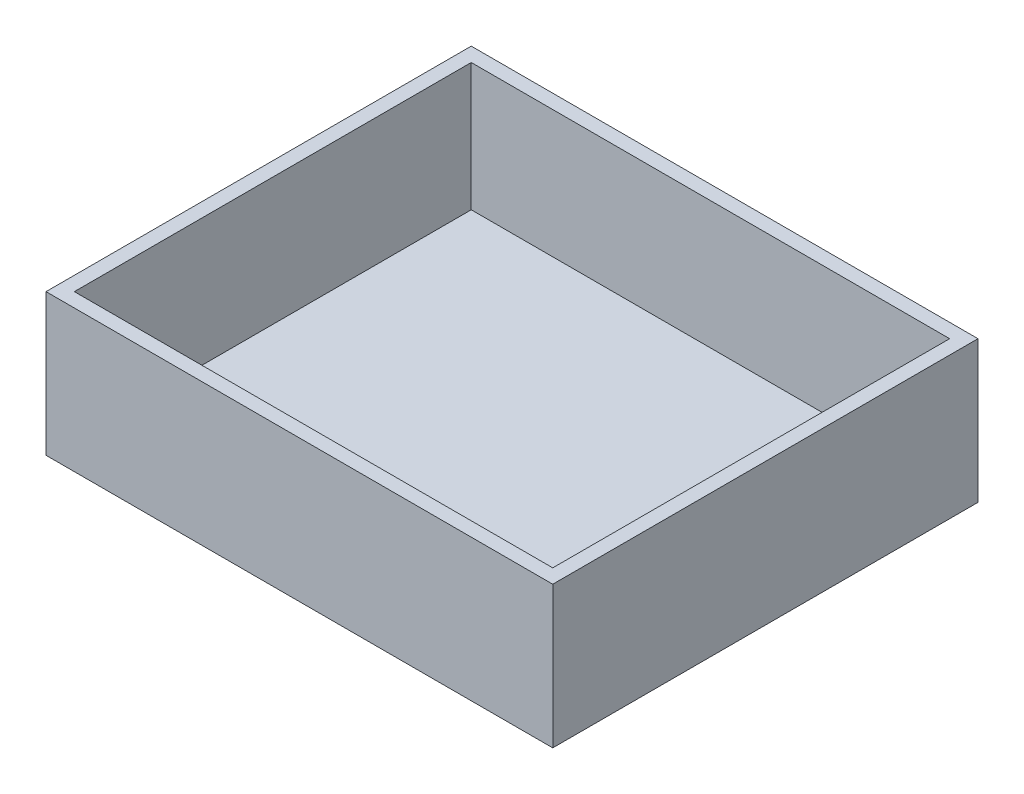
ISO-10303-21;
HEADER;
FILE_DESCRIPTION(('STEP AP214'),'2;1');
FILE_NAME('part.step','',(''),(''),'','','');
FILE_SCHEMA(('AUTOMOTIVE_DESIGN { 1 0 10303 214 1 1 1 1 }'));
ENDSEC;
DATA;
#1=APPLICATION_CONTEXT('core data for automotive mechanical design processes');
#2=APPLICATION_PROTOCOL_DEFINITION('international standard','automotive_design',2000,#1);
#3=PRODUCT_CONTEXT('',#1,'mechanical');
#4=PRODUCT('Part','Part','',(#3));
#5=PRODUCT_RELATED_PRODUCT_CATEGORY('part','',(#4));
#6=PRODUCT_DEFINITION_FORMATION('','',#4);
#7=PRODUCT_DEFINITION_CONTEXT('part definition',#1,'design');
#8=PRODUCT_DEFINITION('design','',#6,#7);
#9=PRODUCT_DEFINITION_SHAPE('','',#8);
#10=(LENGTH_UNIT() NAMED_UNIT(*) SI_UNIT(.MILLI.,.METRE.));
#11=(NAMED_UNIT(*) PLANE_ANGLE_UNIT() SI_UNIT($,.RADIAN.));
#12=(NAMED_UNIT(*) SI_UNIT($,.STERADIAN.) SOLID_ANGLE_UNIT());
#13=UNCERTAINTY_MEASURE_WITH_UNIT(LENGTH_MEASURE(1.E-05),#10,'distance_accuracy_value','');
#14=(GEOMETRIC_REPRESENTATION_CONTEXT(3) GLOBAL_UNCERTAINTY_ASSIGNED_CONTEXT((#13)) GLOBAL_UNIT_ASSIGNED_CONTEXT((#10,
#11,#12)) REPRESENTATION_CONTEXT('',''));
#15=CARTESIAN_POINT('',(0.,0.,0.));
#16=DIRECTION('',(0.,0.,1.));
#17=DIRECTION('',(1.,0.,0.));
#18=AXIS2_PLACEMENT_3D('',#15,#16,#17);
#19=CARTESIAN_POINT('',(0.,0.,0.));
#20=DIRECTION('',(0.,1.,0.));
#21=DIRECTION('',(0.,0.,1.));
#22=AXIS2_PLACEMENT_3D('',#19,#20,#21);
#23=PLANE('',#22);
#24=DIRECTION('',(0.,0.,-1.));
#25=VECTOR('',#24,1.);
#26=CARTESIAN_POINT('',(-29.25,0.,-19.0576678956372));
#27=LINE('',#26,#25);
#28=CARTESIAN_POINT('',(-29.25,0.,-19.0576678956372));
#29=VERTEX_POINT('',#28);
#30=CARTESIAN_POINT('',(-29.25,0.,-24.));
#31=VERTEX_POINT('',#30);
#32=EDGE_CURVE('E224',#29,#31,#27,.T.);
#33=ORIENTED_EDGE('',*,*,#32,.F.);
#34=DIRECTION('',(-1.,0.,0.));
#35=VECTOR('',#34,1.);
#36=CARTESIAN_POINT('',(-29.25,0.,-19.0576678956372));
#37=LINE('',#36,#35);
#38=CARTESIAN_POINT('',(-0.13705379520795,0.,-19.0576678956372));
#39=VERTEX_POINT('',#38);
#40=EDGE_CURVE('E209',#39,#29,#37,.T.);
#41=ORIENTED_EDGE('',*,*,#40,.F.);
#42=DIRECTION('',(0.,0.,1.));
#43=VECTOR('',#42,1.);
#44=CARTESIAN_POINT('',(-0.13705379520795,0.,-19.0576678956372));
#45=LINE('',#44,#43);
#46=CARTESIAN_POINT('',(-0.137053795207948,0.,-24.));
#47=VERTEX_POINT('',#46);
#48=EDGE_CURVE('E212',#47,#39,#45,.T.);
#49=ORIENTED_EDGE('',*,*,#48,.F.);
#50=DIRECTION('',(1.,0.,0.));
#51=VECTOR('',#50,1.);
#52=CARTESIAN_POINT('',(-29.25,0.,-24.));
#53=LINE('',#52,#51);
#54=EDGE_CURVE('E218',#31,#47,#53,.T.);
#55=ORIENTED_EDGE('',*,*,#54,.F.);
#56=EDGE_LOOP('',(#33,#41,#49,#55));
#57=FACE_BOUND('',#56,.T.);
#58=DIRECTION('',(0.,0.,1.));
#59=VECTOR('',#58,1.);
#60=CARTESIAN_POINT('',(-35.75,0.,30.));
#61=LINE('',#60,#59);
#62=CARTESIAN_POINT('',(-35.75,0.,-30.));
#63=VERTEX_POINT('',#62);
#64=CARTESIAN_POINT('',(-35.75,0.,30.));
#65=VERTEX_POINT('',#64);
#66=EDGE_CURVE('E244',#63,#65,#61,.T.);
#67=ORIENTED_EDGE('',*,*,#66,.F.);
#68=DIRECTION('',(-1.,0.,0.));
#69=VECTOR('',#68,1.);
#70=CARTESIAN_POINT('',(35.75,0.,-30.));
#71=LINE('',#70,#69);
#72=CARTESIAN_POINT('',(35.75,0.,-30.));
#73=VERTEX_POINT('',#72);
#74=EDGE_CURVE('E283',#73,#63,#71,.T.);
#75=ORIENTED_EDGE('',*,*,#74,.F.);
#76=DIRECTION('',(0.,0.,-1.));
#77=VECTOR('',#76,1.);
#78=CARTESIAN_POINT('',(35.75,0.,30.));
#79=LINE('',#78,#77);
#80=CARTESIAN_POINT('',(35.75,0.,30.));
#81=VERTEX_POINT('',#80);
#82=EDGE_CURVE('E299',#81,#73,#79,.T.);
#83=ORIENTED_EDGE('',*,*,#82,.F.);
#84=DIRECTION('',(1.,0.,0.));
#85=VECTOR('',#84,1.);
#86=CARTESIAN_POINT('',(35.75,0.,30.));
#87=LINE('',#86,#85);
#88=EDGE_CURVE('E294',#65,#81,#87,.T.);
#89=ORIENTED_EDGE('',*,*,#88,.F.);
#90=EDGE_LOOP('',(#67,#75,#83,#89));
#91=FACE_BOUND('',#90,.T.);
#92=DIRECTION('',(0.,0.,-1.));
#93=VECTOR('',#92,1.);
#94=CARTESIAN_POINT('',(-29.25,0.,24.));
#95=LINE('',#94,#93);
#96=CARTESIAN_POINT('',(-29.25,0.,24.));
#97=VERTEX_POINT('',#96);
#98=CARTESIAN_POINT('',(-29.25,0.,19.5975167891978));
#99=VERTEX_POINT('',#98);
#100=EDGE_CURVE('E63',#97,#99,#95,.T.);
#101=ORIENTED_EDGE('',*,*,#100,.F.);
#102=DIRECTION('',(-1.,0.,0.));
#103=VECTOR('',#102,1.);
#104=CARTESIAN_POINT('',(-29.25,0.,24.));
#105=LINE('',#104,#103);
#106=CARTESIAN_POINT('',(3.45030543518834,0.,24.));
#107=VERTEX_POINT('',#106);
#108=EDGE_CURVE('E61',#107,#97,#105,.T.);
#109=ORIENTED_EDGE('',*,*,#108,.F.);
#110=DIRECTION('',(0.,0.,1.));
#111=VECTOR('',#110,1.);
#112=CARTESIAN_POINT('',(3.45030543518834,0.,24.));
#113=LINE('',#112,#111);
#114=CARTESIAN_POINT('',(3.45030543518834,0.,19.5975167891978));
#115=VERTEX_POINT('',#114);
#116=EDGE_CURVE('E543',#115,#107,#113,.T.);
#117=ORIENTED_EDGE('',*,*,#116,.F.);
#118=DIRECTION('',(1.,0.,0.));
#119=VECTOR('',#118,1.);
#120=CARTESIAN_POINT('',(-29.25,0.,19.5975167891978));
#121=LINE('',#120,#119);
#122=EDGE_CURVE('E554',#99,#115,#121,.T.);
#123=ORIENTED_EDGE('',*,*,#122,.F.);
#124=EDGE_LOOP('',(#101,#109,#117,#123));
#125=FACE_BOUND('',#124,.T.);
#126=ADVANCED_FACE('F44',(#57,#91,#125),#23,.F.);
#127=CARTESIAN_POINT('',(-35.75,20.,30.));
#128=DIRECTION('',(1.,0.,0.));
#129=DIRECTION('',(0.,0.,-1.));
#130=AXIS2_PLACEMENT_3D('',#127,#128,#129);
#131=PLANE('',#130);
#132=ORIENTED_EDGE('',*,*,#66,.T.);
#133=DIRECTION('',(0.,-1.,0.));
#134=VECTOR('',#133,1.);
#135=CARTESIAN_POINT('',(-35.75,20.,30.));
#136=LINE('',#135,#134);
#137=CARTESIAN_POINT('',(-35.75,20.,30.));
#138=VERTEX_POINT('',#137);
#139=EDGE_CURVE('E11',#138,#65,#136,.T.);
#140=ORIENTED_EDGE('',*,*,#139,.F.);
#141=DIRECTION('',(0.,0.,1.));
#142=VECTOR('',#141,1.);
#143=CARTESIAN_POINT('',(-35.75,20.,30.));
#144=LINE('',#143,#142);
#145=CARTESIAN_POINT('',(-35.75,20.,-30.));
#146=VERTEX_POINT('',#145);
#147=EDGE_CURVE('E277',#146,#138,#144,.T.);
#148=ORIENTED_EDGE('',*,*,#147,.F.);
#149=DIRECTION('',(0.,-1.,0.));
#150=VECTOR('',#149,1.);
#151=CARTESIAN_POINT('',(-35.75,20.,-30.));
#152=LINE('',#151,#150);
#153=EDGE_CURVE('E289',#146,#63,#152,.T.);
#154=ORIENTED_EDGE('',*,*,#153,.T.);
#155=EDGE_LOOP('',(#132,#140,#148,#154));
#156=FACE_BOUND('',#155,.T.);
#157=ADVANCED_FACE('F50',(#156),#131,.F.);
#158=CARTESIAN_POINT('',(35.75,20.,30.));
#159=DIRECTION('',(0.,0.,-1.));
#160=DIRECTION('',(-1.,0.,0.));
#161=AXIS2_PLACEMENT_3D('',#158,#159,#160);
#162=PLANE('',#161);
#163=ORIENTED_EDGE('',*,*,#88,.T.);
#164=DIRECTION('',(0.,-1.,0.));
#165=VECTOR('',#164,1.);
#166=CARTESIAN_POINT('',(35.75,20.,30.));
#167=LINE('',#166,#165);
#168=CARTESIAN_POINT('',(35.75,20.,30.));
#169=VERTEX_POINT('',#168);
#170=EDGE_CURVE('E53',#169,#81,#167,.T.);
#171=ORIENTED_EDGE('',*,*,#170,.F.);
#172=DIRECTION('',(1.,0.,0.));
#173=VECTOR('',#172,1.);
#174=CARTESIAN_POINT('',(35.75,20.,30.));
#175=LINE('',#174,#173);
#176=EDGE_CURVE('E278',#138,#169,#175,.T.);
#177=ORIENTED_EDGE('',*,*,#176,.F.);
#178=ORIENTED_EDGE('',*,*,#139,.T.);
#179=EDGE_LOOP('',(#163,#171,#177,#178));
#180=FACE_BOUND('',#179,.T.);
#181=ADVANCED_FACE('F328',(#180),#162,.F.);
#182=CARTESIAN_POINT('',(35.75,20.,30.));
#183=DIRECTION('',(-1.,0.,0.));
#184=DIRECTION('',(0.,0.,1.));
#185=AXIS2_PLACEMENT_3D('',#182,#183,#184);
#186=PLANE('',#185);
#187=ORIENTED_EDGE('',*,*,#82,.T.);
#188=DIRECTION('',(0.,-1.,0.));
#189=VECTOR('',#188,1.);
#190=CARTESIAN_POINT('',(35.75,20.,-30.));
#191=LINE('',#190,#189);
#192=CARTESIAN_POINT('',(35.75,20.,-30.));
#193=VERTEX_POINT('',#192);
#194=EDGE_CURVE('E304',#193,#73,#191,.T.);
#195=ORIENTED_EDGE('',*,*,#194,.F.);
#196=DIRECTION('',(0.,0.,-1.));
#197=VECTOR('',#196,1.);
#198=CARTESIAN_POINT('',(35.75,20.,30.));
#199=LINE('',#198,#197);
#200=EDGE_CURVE('E285',#169,#193,#199,.T.);
#201=ORIENTED_EDGE('',*,*,#200,.F.);
#202=ORIENTED_EDGE('',*,*,#170,.T.);
#203=EDGE_LOOP('',(#187,#195,#201,#202));
#204=FACE_BOUND('',#203,.T.);
#205=ADVANCED_FACE('F314',(#204),#186,.F.);
#206=CARTESIAN_POINT('',(35.75,20.,-30.));
#207=DIRECTION('',(0.,0.,1.));
#208=DIRECTION('',(1.,0.,0.));
#209=AXIS2_PLACEMENT_3D('',#206,#207,#208);
#210=PLANE('',#209);
#211=ORIENTED_EDGE('',*,*,#74,.T.);
#212=ORIENTED_EDGE('',*,*,#153,.F.);
#213=DIRECTION('',(-1.,0.,0.));
#214=VECTOR('',#213,1.);
#215=CARTESIAN_POINT('',(35.75,20.,-30.));
#216=LINE('',#215,#214);
#217=EDGE_CURVE('E290',#193,#146,#216,.T.);
#218=ORIENTED_EDGE('',*,*,#217,.F.);
#219=ORIENTED_EDGE('',*,*,#194,.T.);
#220=EDGE_LOOP('',(#211,#212,#218,#219));
#221=FACE_BOUND('',#220,.T.);
#222=ADVANCED_FACE('F325',(#221),#210,.F.);
#223=CARTESIAN_POINT('',(0.,20.,0.));
#224=DIRECTION('',(0.,1.,0.));
#225=DIRECTION('',(0.,0.,1.));
#226=AXIS2_PLACEMENT_3D('',#223,#224,#225);
#227=PLANE('',#226);
#228=DIRECTION('',(0.,0.,1.));
#229=VECTOR('',#228,1.);
#230=CARTESIAN_POINT('',(-33.75,20.,30.));
#231=LINE('',#230,#229);
#232=CARTESIAN_POINT('',(-33.75,20.,-28.));
#233=VERTEX_POINT('',#232);
#234=CARTESIAN_POINT('',(-33.75,20.,28.));
#235=VERTEX_POINT('',#234);
#236=EDGE_CURVE('E262',#233,#235,#231,.T.);
#237=ORIENTED_EDGE('',*,*,#236,.F.);
#238=DIRECTION('',(-1.,0.,0.));
#239=VECTOR('',#238,1.);
#240=CARTESIAN_POINT('',(35.75,20.,-28.));
#241=LINE('',#240,#239);
#242=CARTESIAN_POINT('',(33.75,20.,-28.));
#243=VERTEX_POINT('',#242);
#244=EDGE_CURVE('E248',#243,#233,#241,.T.);
#245=ORIENTED_EDGE('',*,*,#244,.F.);
#246=DIRECTION('',(0.,0.,-1.));
#247=VECTOR('',#246,1.);
#248=CARTESIAN_POINT('',(33.75,20.,30.));
#249=LINE('',#248,#247);
#250=CARTESIAN_POINT('',(33.75,20.,28.));
#251=VERTEX_POINT('',#250);
#252=EDGE_CURVE('E269',#251,#243,#249,.T.);
#253=ORIENTED_EDGE('',*,*,#252,.F.);
#254=DIRECTION('',(1.,0.,0.));
#255=VECTOR('',#254,1.);
#256=CARTESIAN_POINT('',(35.75,20.,28.));
#257=LINE('',#256,#255);
#258=EDGE_CURVE('E270',#235,#251,#257,.T.);
#259=ORIENTED_EDGE('',*,*,#258,.F.);
#260=EDGE_LOOP('',(#237,#245,#253,#259));
#261=FACE_BOUND('',#260,.T.);
#262=ORIENTED_EDGE('',*,*,#147,.T.);
#263=ORIENTED_EDGE('',*,*,#176,.T.);
#264=ORIENTED_EDGE('',*,*,#200,.T.);
#265=ORIENTED_EDGE('',*,*,#217,.T.);
#266=EDGE_LOOP('',(#262,#263,#264,#265));
#267=FACE_BOUND('',#266,.T.);
#268=ADVANCED_FACE('F327',(#261,#267),#227,.T.);
#269=CARTESIAN_POINT('',(-33.75,20.,30.));
#270=DIRECTION('',(1.,0.,0.));
#271=DIRECTION('',(0.,0.,-1.));
#272=AXIS2_PLACEMENT_3D('',#269,#270,#271);
#273=PLANE('',#272);
#274=DIRECTION('',(0.,0.,1.));
#275=VECTOR('',#274,1.);
#276=CARTESIAN_POINT('',(-33.75,2.,30.));
#277=LINE('',#276,#275);
#278=CARTESIAN_POINT('',(-33.75,2.,-28.));
#279=VERTEX_POINT('',#278);
#280=CARTESIAN_POINT('',(-33.75,2.,28.));
#281=VERTEX_POINT('',#280);
#282=EDGE_CURVE('E185',#279,#281,#277,.T.);
#283=ORIENTED_EDGE('',*,*,#282,.F.);
#284=DIRECTION('',(0.,-1.,0.));
#285=VECTOR('',#284,1.);
#286=CARTESIAN_POINT('',(-33.75,20.,-28.));
#287=LINE('',#286,#285);
#288=EDGE_CURVE('E245',#233,#279,#287,.T.);
#289=ORIENTED_EDGE('',*,*,#288,.F.);
#290=ORIENTED_EDGE('',*,*,#236,.T.);
#291=DIRECTION('',(0.,-1.,0.));
#292=VECTOR('',#291,1.);
#293=CARTESIAN_POINT('',(-33.75,20.,28.));
#294=LINE('',#293,#292);
#295=EDGE_CURVE('E236',#235,#281,#294,.T.);
#296=ORIENTED_EDGE('',*,*,#295,.T.);
#297=EDGE_LOOP('',(#283,#289,#290,#296));
#298=FACE_BOUND('',#297,.T.);
#299=ADVANCED_FACE('F348',(#298),#273,.T.);
#300=CARTESIAN_POINT('',(35.75,20.,28.));
#301=DIRECTION('',(0.,0.,-1.));
#302=DIRECTION('',(-1.,0.,0.));
#303=AXIS2_PLACEMENT_3D('',#300,#301,#302);
#304=PLANE('',#303);
#305=DIRECTION('',(1.,0.,0.));
#306=VECTOR('',#305,1.);
#307=CARTESIAN_POINT('',(35.75,2.,28.));
#308=LINE('',#307,#306);
#309=CARTESIAN_POINT('',(33.75,2.,28.));
#310=VERTEX_POINT('',#309);
#311=EDGE_CURVE('E189',#281,#310,#308,.T.);
#312=ORIENTED_EDGE('',*,*,#311,.F.);
#313=ORIENTED_EDGE('',*,*,#295,.F.);
#314=ORIENTED_EDGE('',*,*,#258,.T.);
#315=DIRECTION('',(0.,-1.,0.));
#316=VECTOR('',#315,1.);
#317=CARTESIAN_POINT('',(33.75,20.,28.));
#318=LINE('',#317,#316);
#319=EDGE_CURVE('E242',#251,#310,#318,.T.);
#320=ORIENTED_EDGE('',*,*,#319,.T.);
#321=EDGE_LOOP('',(#312,#313,#314,#320));
#322=FACE_BOUND('',#321,.T.);
#323=ADVANCED_FACE('F351',(#322),#304,.T.);
#324=CARTESIAN_POINT('',(33.75,20.,30.));
#325=DIRECTION('',(-1.,0.,0.));
#326=DIRECTION('',(0.,0.,1.));
#327=AXIS2_PLACEMENT_3D('',#324,#325,#326);
#328=PLANE('',#327);
#329=DIRECTION('',(0.,0.,-1.));
#330=VECTOR('',#329,1.);
#331=CARTESIAN_POINT('',(33.75,2.,30.));
#332=LINE('',#331,#330);
#333=CARTESIAN_POINT('',(33.75,2.,-28.));
#334=VERTEX_POINT('',#333);
#335=EDGE_CURVE('E252',#310,#334,#332,.T.);
#336=ORIENTED_EDGE('',*,*,#335,.F.);
#337=ORIENTED_EDGE('',*,*,#319,.F.);
#338=ORIENTED_EDGE('',*,*,#252,.T.);
#339=DIRECTION('',(0.,-1.,0.));
#340=VECTOR('',#339,1.);
#341=CARTESIAN_POINT('',(33.75,20.,-28.));
#342=LINE('',#341,#340);
#343=EDGE_CURVE('E247',#243,#334,#342,.T.);
#344=ORIENTED_EDGE('',*,*,#343,.T.);
#345=EDGE_LOOP('',(#336,#337,#338,#344));
#346=FACE_BOUND('',#345,.T.);
#347=ADVANCED_FACE('F372',(#346),#328,.T.);
#348=CARTESIAN_POINT('',(35.75,20.,-28.));
#349=DIRECTION('',(0.,0.,1.));
#350=DIRECTION('',(1.,0.,0.));
#351=AXIS2_PLACEMENT_3D('',#348,#349,#350);
#352=PLANE('',#351);
#353=DIRECTION('',(-1.,0.,0.));
#354=VECTOR('',#353,1.);
#355=CARTESIAN_POINT('',(35.75,2.,-28.));
#356=LINE('',#355,#354);
#357=EDGE_CURVE('E256',#334,#279,#356,.T.);
#358=ORIENTED_EDGE('',*,*,#357,.F.);
#359=ORIENTED_EDGE('',*,*,#343,.F.);
#360=ORIENTED_EDGE('',*,*,#244,.T.);
#361=ORIENTED_EDGE('',*,*,#288,.T.);
#362=EDGE_LOOP('',(#358,#359,#360,#361));
#363=FACE_BOUND('',#362,.T.);
#364=ADVANCED_FACE('F375',(#363),#352,.T.);
#365=CARTESIAN_POINT('',(0.,2.,0.));
#366=DIRECTION('',(0.,1.,0.));
#367=DIRECTION('',(0.,0.,1.));
#368=AXIS2_PLACEMENT_3D('',#365,#366,#367);
#369=PLANE('',#368);
#370=ORIENTED_EDGE('',*,*,#282,.T.);
#371=ORIENTED_EDGE('',*,*,#311,.T.);
#372=ORIENTED_EDGE('',*,*,#335,.T.);
#373=ORIENTED_EDGE('',*,*,#357,.T.);
#374=EDGE_LOOP('',(#370,#371,#372,#373));
#375=FACE_BOUND('',#374,.T.);
#376=ADVANCED_FACE('F369',(#375),#369,.T.);
#377=CARTESIAN_POINT('',(-29.25,-3.,-19.0576678956372));
#378=DIRECTION('',(1.,0.,0.));
#379=DIRECTION('',(0.,0.,-1.));
#380=AXIS2_PLACEMENT_3D('',#377,#378,#379);
#381=PLANE('',#380);
#382=ORIENTED_EDGE('',*,*,#32,.T.);
#383=DIRECTION('',(0.,1.,0.));
#384=VECTOR('',#383,1.);
#385=CARTESIAN_POINT('',(-29.25,-3.,-24.));
#386=LINE('',#385,#384);
#387=CARTESIAN_POINT('',(-29.25,-3.,-24.));
#388=VERTEX_POINT('',#387);
#389=EDGE_CURVE('E192',#388,#31,#386,.T.);
#390=ORIENTED_EDGE('',*,*,#389,.F.);
#391=DIRECTION('',(0.,0.,-1.));
#392=VECTOR('',#391,1.);
#393=CARTESIAN_POINT('',(-29.25,-3.,-19.0576678956372));
#394=LINE('',#393,#392);
#395=CARTESIAN_POINT('',(-29.25,-3.,-19.0576678956372));
#396=VERTEX_POINT('',#395);
#397=EDGE_CURVE('E214',#396,#388,#394,.T.);
#398=ORIENTED_EDGE('',*,*,#397,.F.);
#399=DIRECTION('',(0.,1.,0.));
#400=VECTOR('',#399,1.);
#401=CARTESIAN_POINT('',(-29.25,-3.,-19.0576678956372));
#402=LINE('',#401,#400);
#403=EDGE_CURVE('E202',#396,#29,#402,.T.);
#404=ORIENTED_EDGE('',*,*,#403,.T.);
#405=EDGE_LOOP('',(#382,#390,#398,#404));
#406=FACE_BOUND('',#405,.T.);
#407=ADVANCED_FACE('F382',(#406),#381,.F.);
#408=CARTESIAN_POINT('',(-29.25,-3.,-24.));
#409=DIRECTION('',(0.,0.,1.));
#410=DIRECTION('',(1.,0.,0.));
#411=AXIS2_PLACEMENT_3D('',#408,#409,#410);
#412=PLANE('',#411);
#413=ORIENTED_EDGE('',*,*,#54,.T.);
#414=DIRECTION('',(0.,1.,0.));
#415=VECTOR('',#414,1.);
#416=CARTESIAN_POINT('',(-0.137053795207948,-3.,-24.));
#417=LINE('',#416,#415);
#418=CARTESIAN_POINT('',(-0.137053795207948,-3.,-24.));
#419=VERTEX_POINT('',#418);
#420=EDGE_CURVE('E197',#419,#47,#417,.T.);
#421=ORIENTED_EDGE('',*,*,#420,.F.);
#422=DIRECTION('',(1.,0.,0.));
#423=VECTOR('',#422,1.);
#424=CARTESIAN_POINT('',(-29.25,-3.,-24.));
#425=LINE('',#424,#423);
#426=EDGE_CURVE('E235',#388,#419,#425,.T.);
#427=ORIENTED_EDGE('',*,*,#426,.F.);
#428=ORIENTED_EDGE('',*,*,#389,.T.);
#429=EDGE_LOOP('',(#413,#421,#427,#428));
#430=FACE_BOUND('',#429,.T.);
#431=ADVANCED_FACE('F387',(#430),#412,.F.);
#432=CARTESIAN_POINT('',(-0.13705379520795,-3.,-19.0576678956372));
#433=DIRECTION('',(-1.,0.,0.));
#434=DIRECTION('',(0.,0.,1.));
#435=AXIS2_PLACEMENT_3D('',#432,#433,#434);
#436=PLANE('',#435);
#437=ORIENTED_EDGE('',*,*,#48,.T.);
#438=DIRECTION('',(0.,1.,0.));
#439=VECTOR('',#438,1.);
#440=CARTESIAN_POINT('',(-0.13705379520795,-3.,-19.0576678956372));
#441=LINE('',#440,#439);
#442=CARTESIAN_POINT('',(-0.13705379520795,-3.,-19.0576678956372));
#443=VERTEX_POINT('',#442);
#444=EDGE_CURVE('E203',#443,#39,#441,.T.);
#445=ORIENTED_EDGE('',*,*,#444,.F.);
#446=DIRECTION('',(0.,0.,1.));
#447=VECTOR('',#446,1.);
#448=CARTESIAN_POINT('',(-0.13705379520795,-3.,-19.0576678956372));
#449=LINE('',#448,#447);
#450=EDGE_CURVE('E230',#419,#443,#449,.T.);
#451=ORIENTED_EDGE('',*,*,#450,.F.);
#452=ORIENTED_EDGE('',*,*,#420,.T.);
#453=EDGE_LOOP('',(#437,#445,#451,#452));
#454=FACE_BOUND('',#453,.T.);
#455=ADVANCED_FACE('F394',(#454),#436,.F.);
#456=CARTESIAN_POINT('',(-29.25,-3.,-19.0576678956372));
#457=DIRECTION('',(0.,0.,-1.));
#458=DIRECTION('',(-1.,0.,0.));
#459=AXIS2_PLACEMENT_3D('',#456,#457,#458);
#460=PLANE('',#459);
#461=ORIENTED_EDGE('',*,*,#40,.T.);
#462=ORIENTED_EDGE('',*,*,#403,.F.);
#463=DIRECTION('',(-1.,0.,0.));
#464=VECTOR('',#463,1.);
#465=CARTESIAN_POINT('',(-29.25,-3.,-19.0576678956372));
#466=LINE('',#465,#464);
#467=EDGE_CURVE('E207',#443,#396,#466,.T.);
#468=ORIENTED_EDGE('',*,*,#467,.F.);
#469=ORIENTED_EDGE('',*,*,#444,.T.);
#470=EDGE_LOOP('',(#461,#462,#468,#469));
#471=FACE_BOUND('',#470,.T.);
#472=ADVANCED_FACE('F399',(#471),#460,.F.);
#473=CARTESIAN_POINT('',(0.,-3.,0.));
#474=DIRECTION('',(0.,-1.,0.));
#475=DIRECTION('',(0.,0.,-1.));
#476=AXIS2_PLACEMENT_3D('',#473,#474,#475);
#477=PLANE('',#476);
#478=ORIENTED_EDGE('',*,*,#397,.T.);
#479=ORIENTED_EDGE('',*,*,#426,.T.);
#480=ORIENTED_EDGE('',*,*,#450,.T.);
#481=ORIENTED_EDGE('',*,*,#467,.T.);
#482=EDGE_LOOP('',(#478,#479,#480,#481));
#483=FACE_BOUND('',#482,.T.);
#484=ADVANCED_FACE('F404',(#483),#477,.T.);
#485=CARTESIAN_POINT('',(-29.25,-3.,24.));
#486=DIRECTION('',(1.,0.,0.));
#487=DIRECTION('',(0.,0.,-1.));
#488=AXIS2_PLACEMENT_3D('',#485,#486,#487);
#489=PLANE('',#488);
#490=ORIENTED_EDGE('',*,*,#100,.T.);
#491=DIRECTION('',(0.,1.,0.));
#492=VECTOR('',#491,1.);
#493=CARTESIAN_POINT('',(-29.25,-3.,19.5975167891978));
#494=LINE('',#493,#492);
#495=CARTESIAN_POINT('',(-29.25,-3.,19.5975167891978));
#496=VERTEX_POINT('',#495);
#497=EDGE_CURVE('E165',#496,#99,#494,.T.);
#498=ORIENTED_EDGE('',*,*,#497,.F.);
#499=DIRECTION('',(0.,0.,-1.));
#500=VECTOR('',#499,1.);
#501=CARTESIAN_POINT('',(-29.25,-3.,24.));
#502=LINE('',#501,#500);
#503=CARTESIAN_POINT('',(-29.25,-3.,24.));
#504=VERTEX_POINT('',#503);
#505=EDGE_CURVE('E166',#504,#496,#502,.T.);
#506=ORIENTED_EDGE('',*,*,#505,.F.);
#507=DIRECTION('',(0.,1.,0.));
#508=VECTOR('',#507,1.);
#509=CARTESIAN_POINT('',(-29.25,-3.,24.));
#510=LINE('',#509,#508);
#511=EDGE_CURVE('E539',#504,#97,#510,.T.);
#512=ORIENTED_EDGE('',*,*,#511,.T.);
#513=EDGE_LOOP('',(#490,#498,#506,#512));
#514=FACE_BOUND('',#513,.T.);
#515=ADVANCED_FACE('F179',(#514),#489,.F.);
#516=CARTESIAN_POINT('',(-29.25,-3.,19.5975167891978));
#517=DIRECTION('',(0.,0.,1.));
#518=DIRECTION('',(1.,0.,0.));
#519=AXIS2_PLACEMENT_3D('',#516,#517,#518);
#520=PLANE('',#519);
#521=ORIENTED_EDGE('',*,*,#122,.T.);
#522=DIRECTION('',(0.,1.,0.));
#523=VECTOR('',#522,1.);
#524=CARTESIAN_POINT('',(3.45030543518834,-3.,19.5975167891978));
#525=LINE('',#524,#523);
#526=CARTESIAN_POINT('',(3.45030543518834,-3.,19.5975167891978));
#527=VERTEX_POINT('',#526);
#528=EDGE_CURVE('E163',#527,#115,#525,.T.);
#529=ORIENTED_EDGE('',*,*,#528,.F.);
#530=DIRECTION('',(1.,0.,0.));
#531=VECTOR('',#530,1.);
#532=CARTESIAN_POINT('',(-29.25,-3.,19.5975167891978));
#533=LINE('',#532,#531);
#534=EDGE_CURVE('E160',#496,#527,#533,.T.);
#535=ORIENTED_EDGE('',*,*,#534,.F.);
#536=ORIENTED_EDGE('',*,*,#497,.T.);
#537=EDGE_LOOP('',(#521,#529,#535,#536));
#538=FACE_BOUND('',#537,.T.);
#539=ADVANCED_FACE('F159',(#538),#520,.F.);
#540=CARTESIAN_POINT('',(3.45030543518834,-3.,24.));
#541=DIRECTION('',(-1.,0.,0.));
#542=DIRECTION('',(0.,0.,1.));
#543=AXIS2_PLACEMENT_3D('',#540,#541,#542);
#544=PLANE('',#543);
#545=ORIENTED_EDGE('',*,*,#116,.T.);
#546=DIRECTION('',(0.,1.,0.));
#547=VECTOR('',#546,1.);
#548=CARTESIAN_POINT('',(3.45030543518834,-3.,24.));
#549=LINE('',#548,#547);
#550=CARTESIAN_POINT('',(3.45030543518834,-3.,24.));
#551=VERTEX_POINT('',#550);
#552=EDGE_CURVE('E190',#551,#107,#549,.T.);
#553=ORIENTED_EDGE('',*,*,#552,.F.);
#554=DIRECTION('',(0.,0.,1.));
#555=VECTOR('',#554,1.);
#556=CARTESIAN_POINT('',(3.45030543518834,-3.,24.));
#557=LINE('',#556,#555);
#558=EDGE_CURVE('E169',#527,#551,#557,.T.);
#559=ORIENTED_EDGE('',*,*,#558,.F.);
#560=ORIENTED_EDGE('',*,*,#528,.T.);
#561=EDGE_LOOP('',(#545,#553,#559,#560));
#562=FACE_BOUND('',#561,.T.);
#563=ADVANCED_FACE('F423',(#562),#544,.F.);
#564=CARTESIAN_POINT('',(-29.25,-3.,24.));
#565=DIRECTION('',(0.,0.,-1.));
#566=DIRECTION('',(-1.,0.,0.));
#567=AXIS2_PLACEMENT_3D('',#564,#565,#566);
#568=PLANE('',#567);
#569=ORIENTED_EDGE('',*,*,#108,.T.);
#570=ORIENTED_EDGE('',*,*,#511,.F.);
#571=DIRECTION('',(-1.,0.,0.));
#572=VECTOR('',#571,1.);
#573=CARTESIAN_POINT('',(-29.25,-3.,24.));
#574=LINE('',#573,#572);
#575=EDGE_CURVE('E175',#551,#504,#574,.T.);
#576=ORIENTED_EDGE('',*,*,#575,.F.);
#577=ORIENTED_EDGE('',*,*,#552,.T.);
#578=EDGE_LOOP('',(#569,#570,#576,#577));
#579=FACE_BOUND('',#578,.T.);
#580=ADVANCED_FACE('F422',(#579),#568,.F.);
#581=CARTESIAN_POINT('',(0.,-3.,0.));
#582=DIRECTION('',(0.,-1.,0.));
#583=DIRECTION('',(0.,0.,-1.));
#584=AXIS2_PLACEMENT_3D('',#581,#582,#583);
#585=PLANE('',#584);
#586=ORIENTED_EDGE('',*,*,#505,.T.);
#587=ORIENTED_EDGE('',*,*,#534,.T.);
#588=ORIENTED_EDGE('',*,*,#558,.T.);
#589=ORIENTED_EDGE('',*,*,#575,.T.);
#590=EDGE_LOOP('',(#586,#587,#588,#589));
#591=FACE_BOUND('',#590,.T.);
#592=ADVANCED_FACE('F174',(#591),#585,.T.);
#593=CLOSED_SHELL('',(#126,#157,#181,#205,#222,#268,#299,#323,#347,#364,#376,#407,#431,#455,
#472,#484,#515,#539,#563,#580,#592));
#594=MANIFOLD_SOLID_BREP('B2',#593);
#595=ADVANCED_BREP_SHAPE_REPRESENTATION('',(#18,#594),#14);
#596=SHAPE_DEFINITION_REPRESENTATION(#9,#595);
ENDSEC;
END-ISO-10303-21;
